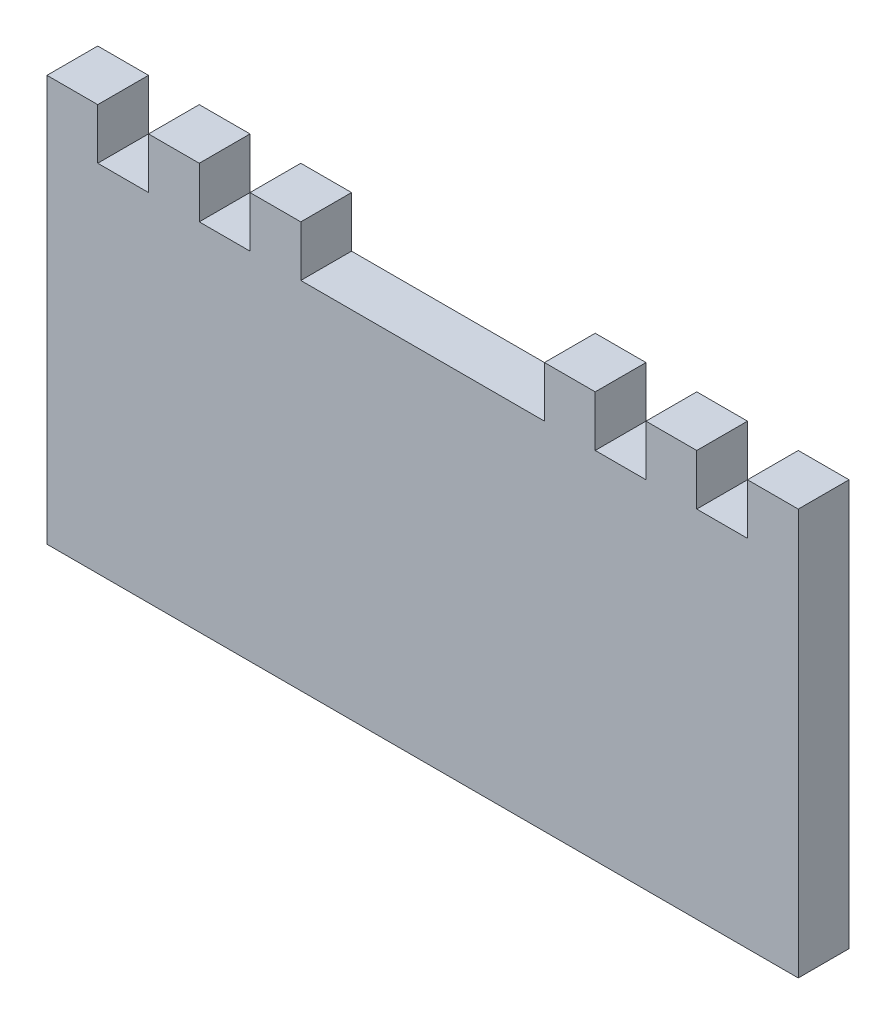
ISO-10303-21;
HEADER;
FILE_DESCRIPTION(('STEP AP214'),'2;1');
FILE_NAME('part.step','',(''),(''),'','','');
FILE_SCHEMA(('AUTOMOTIVE_DESIGN { 1 0 10303 214 1 1 1 1 }'));
ENDSEC;
DATA;
#1=APPLICATION_CONTEXT('core data for automotive mechanical design processes');
#2=APPLICATION_PROTOCOL_DEFINITION('international standard','automotive_design',2000,#1);
#3=PRODUCT_CONTEXT('',#1,'mechanical');
#4=PRODUCT('Part','Part','',(#3));
#5=PRODUCT_RELATED_PRODUCT_CATEGORY('part','',(#4));
#6=PRODUCT_DEFINITION_FORMATION('','',#4);
#7=PRODUCT_DEFINITION_CONTEXT('part definition',#1,'design');
#8=PRODUCT_DEFINITION('design','',#6,#7);
#9=PRODUCT_DEFINITION_SHAPE('','',#8);
#10=(LENGTH_UNIT() NAMED_UNIT(*) SI_UNIT(.MILLI.,.METRE.));
#11=(NAMED_UNIT(*) PLANE_ANGLE_UNIT() SI_UNIT($,.RADIAN.));
#12=(NAMED_UNIT(*) SI_UNIT($,.STERADIAN.) SOLID_ANGLE_UNIT());
#13=UNCERTAINTY_MEASURE_WITH_UNIT(LENGTH_MEASURE(1.E-05),#10,'distance_accuracy_value','');
#14=(GEOMETRIC_REPRESENTATION_CONTEXT(3) GLOBAL_UNCERTAINTY_ASSIGNED_CONTEXT((#13)) GLOBAL_UNIT_ASSIGNED_CONTEXT((#10,
#11,#12)) REPRESENTATION_CONTEXT('',''));
#15=CARTESIAN_POINT('',(0.,0.,0.));
#16=DIRECTION('',(0.,0.,1.));
#17=DIRECTION('',(1.,0.,0.));
#18=AXIS2_PLACEMENT_3D('',#15,#16,#17);
#19=CARTESIAN_POINT('',(-67.192826576935,-4.58125751271907,5.));
#20=DIRECTION('',(-1.,0.,0.));
#21=DIRECTION('',(0.,0.,1.));
#22=AXIS2_PLACEMENT_3D('',#19,#20,#21);
#23=PLANE('',#22);
#24=DIRECTION('',(0.,1.,0.));
#25=VECTOR('',#24,1.);
#26=CARTESIAN_POINT('',(-67.192826576935,-4.58125751271907,0.));
#27=LINE('',#26,#25);
#28=CARTESIAN_POINT('',(-67.192826576935,-9.58125751271907,0.));
#29=VERTEX_POINT('',#28);
#30=CARTESIAN_POINT('',(-67.192826576935,-4.58125751271907,0.));
#31=VERTEX_POINT('',#30);
#32=EDGE_CURVE('E225',#29,#31,#27,.T.);
#33=ORIENTED_EDGE('',*,*,#32,.T.);
#34=DIRECTION('',(0.,0.,-1.));
#35=VECTOR('',#34,1.);
#36=CARTESIAN_POINT('',(-67.192826576935,-4.58125751271907,5.));
#37=LINE('',#36,#35);
#38=CARTESIAN_POINT('',(-67.192826576935,-4.58125751271907,5.));
#39=VERTEX_POINT('',#38);
#40=EDGE_CURVE('E11',#39,#31,#37,.T.);
#41=ORIENTED_EDGE('',*,*,#40,.F.);
#42=DIRECTION('',(0.,1.,0.));
#43=VECTOR('',#42,1.);
#44=CARTESIAN_POINT('',(-67.192826576935,-4.58125751271907,5.));
#45=LINE('',#44,#43);
#46=CARTESIAN_POINT('',(-67.192826576935,-9.58125751271907,5.));
#47=VERTEX_POINT('',#46);
#48=EDGE_CURVE('E271',#47,#39,#45,.T.);
#49=ORIENTED_EDGE('',*,*,#48,.F.);
#50=DIRECTION('',(0.,0.,-1.));
#51=VECTOR('',#50,1.);
#52=CARTESIAN_POINT('',(-67.192826576935,-9.58125751271907,5.));
#53=LINE('',#52,#51);
#54=EDGE_CURVE('E221',#47,#29,#53,.T.);
#55=ORIENTED_EDGE('',*,*,#54,.T.);
#56=EDGE_LOOP('',(#33,#41,#49,#55));
#57=FACE_BOUND('',#56,.T.);
#58=ADVANCED_FACE('F33',(#57),#23,.F.);
#59=CARTESIAN_POINT('',(-67.192826576935,-4.58125751271907,5.));
#60=DIRECTION('',(0.,-1.,0.));
#61=DIRECTION('',(0.,0.,-1.));
#62=AXIS2_PLACEMENT_3D('',#59,#60,#61);
#63=PLANE('',#62);
#64=DIRECTION('',(-1.,0.,0.));
#65=VECTOR('',#64,1.);
#66=CARTESIAN_POINT('',(-67.192826576935,-4.58125751271907,0.));
#67=LINE('',#66,#65);
#68=CARTESIAN_POINT('',(-72.192826576935,-4.58125751271907,0.));
#69=VERTEX_POINT('',#68);
#70=EDGE_CURVE('E228',#31,#69,#67,.T.);
#71=ORIENTED_EDGE('',*,*,#70,.T.);
#72=DIRECTION('',(0.,0.,-1.));
#73=VECTOR('',#72,1.);
#74=CARTESIAN_POINT('',(-72.192826576935,-4.58125751271907,5.));
#75=LINE('',#74,#73);
#76=CARTESIAN_POINT('',(-72.192826576935,-4.58125751271907,5.));
#77=VERTEX_POINT('',#76);
#78=EDGE_CURVE('E41',#77,#69,#75,.T.);
#79=ORIENTED_EDGE('',*,*,#78,.F.);
#80=DIRECTION('',(-1.,0.,0.));
#81=VECTOR('',#80,1.);
#82=CARTESIAN_POINT('',(-67.192826576935,-4.58125751271907,5.));
#83=LINE('',#82,#81);
#84=EDGE_CURVE('E140',#39,#77,#83,.T.);
#85=ORIENTED_EDGE('',*,*,#84,.F.);
#86=ORIENTED_EDGE('',*,*,#40,.T.);
#87=EDGE_LOOP('',(#71,#79,#85,#86));
#88=FACE_BOUND('',#87,.T.);
#89=ADVANCED_FACE('F409',(#88),#63,.F.);
#90=CARTESIAN_POINT('',(-72.192826576935,-4.58125751271907,5.));
#91=DIRECTION('',(1.,0.,0.));
#92=DIRECTION('',(0.,0.,-1.));
#93=AXIS2_PLACEMENT_3D('',#90,#91,#92);
#94=PLANE('',#93);
#95=DIRECTION('',(0.,-1.,0.));
#96=VECTOR('',#95,1.);
#97=CARTESIAN_POINT('',(-72.192826576935,-4.58125751271907,0.));
#98=LINE('',#97,#96);
#99=CARTESIAN_POINT('',(-72.192826576935,-9.58125751271907,0.));
#100=VERTEX_POINT('',#99);
#101=EDGE_CURVE('E230',#69,#100,#98,.T.);
#102=ORIENTED_EDGE('',*,*,#101,.T.);
#103=DIRECTION('',(0.,0.,-1.));
#104=VECTOR('',#103,1.);
#105=CARTESIAN_POINT('',(-72.192826576935,-9.58125751271907,5.));
#106=LINE('',#105,#104);
#107=CARTESIAN_POINT('',(-72.192826576935,-9.58125751271907,5.));
#108=VERTEX_POINT('',#107);
#109=EDGE_CURVE('E326',#108,#100,#106,.T.);
#110=ORIENTED_EDGE('',*,*,#109,.F.);
#111=DIRECTION('',(0.,-1.,0.));
#112=VECTOR('',#111,1.);
#113=CARTESIAN_POINT('',(-72.192826576935,-4.58125751271907,5.));
#114=LINE('',#113,#112);
#115=EDGE_CURVE('E334',#77,#108,#114,.T.);
#116=ORIENTED_EDGE('',*,*,#115,.F.);
#117=ORIENTED_EDGE('',*,*,#78,.T.);
#118=EDGE_LOOP('',(#102,#110,#116,#117));
#119=FACE_BOUND('',#118,.T.);
#120=ADVANCED_FACE('F332',(#119),#94,.F.);
#121=CARTESIAN_POINT('',(-72.192826576935,-9.58125751271907,5.));
#122=DIRECTION('',(0.,-1.,0.));
#123=DIRECTION('',(1.,0.,0.));
#124=AXIS2_PLACEMENT_3D('',#121,#122,#123);
#125=PLANE('',#124);
#126=DIRECTION('',(-1.,0.,0.));
#127=VECTOR('',#126,1.);
#128=CARTESIAN_POINT('',(-72.192826576935,-9.58125751271907,0.));
#129=LINE('',#128,#127);
#130=CARTESIAN_POINT('',(-77.192826576935,-9.58125751271908,0.));
#131=VERTEX_POINT('',#130);
#132=EDGE_CURVE('E232',#100,#131,#129,.T.);
#133=ORIENTED_EDGE('',*,*,#132,.T.);
#134=DIRECTION('',(0.,0.,-1.));
#135=VECTOR('',#134,1.);
#136=CARTESIAN_POINT('',(-77.192826576935,-9.58125751271908,5.));
#137=LINE('',#136,#135);
#138=CARTESIAN_POINT('',(-77.192826576935,-9.58125751271908,5.));
#139=VERTEX_POINT('',#138);
#140=EDGE_CURVE('E323',#139,#131,#137,.T.);
#141=ORIENTED_EDGE('',*,*,#140,.F.);
#142=DIRECTION('',(-1.,0.,0.));
#143=VECTOR('',#142,1.);
#144=CARTESIAN_POINT('',(-72.192826576935,-9.58125751271907,5.));
#145=LINE('',#144,#143);
#146=EDGE_CURVE('E352',#108,#139,#145,.T.);
#147=ORIENTED_EDGE('',*,*,#146,.F.);
#148=ORIENTED_EDGE('',*,*,#109,.T.);
#149=EDGE_LOOP('',(#133,#141,#147,#148));
#150=FACE_BOUND('',#149,.T.);
#151=ADVANCED_FACE('F343',(#150),#125,.F.);
#152=CARTESIAN_POINT('',(-77.192826576935,-4.58125751271907,5.));
#153=DIRECTION('',(-1.,0.,0.));
#154=DIRECTION('',(0.,0.,1.));
#155=AXIS2_PLACEMENT_3D('',#152,#153,#154);
#156=PLANE('',#155);
#157=DIRECTION('',(0.,1.,0.));
#158=VECTOR('',#157,1.);
#159=CARTESIAN_POINT('',(-77.192826576935,-4.58125751271907,0.));
#160=LINE('',#159,#158);
#161=CARTESIAN_POINT('',(-77.192826576935,-4.58125751271907,0.));
#162=VERTEX_POINT('',#161);
#163=EDGE_CURVE('E234',#131,#162,#160,.T.);
#164=ORIENTED_EDGE('',*,*,#163,.T.);
#165=DIRECTION('',(0.,0.,-1.));
#166=VECTOR('',#165,1.);
#167=CARTESIAN_POINT('',(-77.192826576935,-4.58125751271907,5.));
#168=LINE('',#167,#166);
#169=CARTESIAN_POINT('',(-77.192826576935,-4.58125751271907,5.));
#170=VERTEX_POINT('',#169);
#171=EDGE_CURVE('E320',#170,#162,#168,.T.);
#172=ORIENTED_EDGE('',*,*,#171,.F.);
#173=DIRECTION('',(0.,1.,0.));
#174=VECTOR('',#173,1.);
#175=CARTESIAN_POINT('',(-77.192826576935,-4.58125751271907,5.));
#176=LINE('',#175,#174);
#177=EDGE_CURVE('E349',#139,#170,#176,.T.);
#178=ORIENTED_EDGE('',*,*,#177,.F.);
#179=ORIENTED_EDGE('',*,*,#140,.T.);
#180=EDGE_LOOP('',(#164,#172,#178,#179));
#181=FACE_BOUND('',#180,.T.);
#182=ADVANCED_FACE('F347',(#181),#156,.F.);
#183=CARTESIAN_POINT('',(-82.192826576935,-4.58125751271907,5.));
#184=DIRECTION('',(0.,-1.,0.));
#185=DIRECTION('',(0.,0.,-1.));
#186=AXIS2_PLACEMENT_3D('',#183,#184,#185);
#187=PLANE('',#186);
#188=DIRECTION('',(-1.,0.,0.));
#189=VECTOR('',#188,1.);
#190=CARTESIAN_POINT('',(-82.192826576935,-4.58125751271907,0.));
#191=LINE('',#190,#189);
#192=CARTESIAN_POINT('',(-82.192826576935,-4.58125751271907,0.));
#193=VERTEX_POINT('',#192);
#194=EDGE_CURVE('E236',#162,#193,#191,.T.);
#195=ORIENTED_EDGE('',*,*,#194,.T.);
#196=DIRECTION('',(0.,0.,-1.));
#197=VECTOR('',#196,1.);
#198=CARTESIAN_POINT('',(-82.192826576935,-4.58125751271907,5.));
#199=LINE('',#198,#197);
#200=CARTESIAN_POINT('',(-82.192826576935,-4.58125751271907,5.));
#201=VERTEX_POINT('',#200);
#202=EDGE_CURVE('E317',#201,#193,#199,.T.);
#203=ORIENTED_EDGE('',*,*,#202,.F.);
#204=DIRECTION('',(-1.,0.,0.));
#205=VECTOR('',#204,1.);
#206=CARTESIAN_POINT('',(-82.192826576935,-4.58125751271907,5.));
#207=LINE('',#206,#205);
#208=EDGE_CURVE('E351',#170,#201,#207,.T.);
#209=ORIENTED_EDGE('',*,*,#208,.F.);
#210=ORIENTED_EDGE('',*,*,#171,.T.);
#211=EDGE_LOOP('',(#195,#203,#209,#210));
#212=FACE_BOUND('',#211,.T.);
#213=ADVANCED_FACE('F422',(#212),#187,.F.);
#214=CARTESIAN_POINT('',(-82.192826576935,-4.58125751271907,5.));
#215=DIRECTION('',(1.,0.,0.));
#216=DIRECTION('',(0.,0.,-1.));
#217=AXIS2_PLACEMENT_3D('',#214,#215,#216);
#218=PLANE('',#217);
#219=DIRECTION('',(0.,-1.,0.));
#220=VECTOR('',#219,1.);
#221=CARTESIAN_POINT('',(-82.192826576935,-4.58125751271907,0.));
#222=LINE('',#221,#220);
#223=CARTESIAN_POINT('',(-82.192826576935,-9.58125751271907,0.));
#224=VERTEX_POINT('',#223);
#225=EDGE_CURVE('E238',#193,#224,#222,.T.);
#226=ORIENTED_EDGE('',*,*,#225,.T.);
#227=DIRECTION('',(0.,0.,-1.));
#228=VECTOR('',#227,1.);
#229=CARTESIAN_POINT('',(-82.192826576935,-9.58125751271907,5.));
#230=LINE('',#229,#228);
#231=CARTESIAN_POINT('',(-82.192826576935,-9.58125751271907,5.));
#232=VERTEX_POINT('',#231);
#233=EDGE_CURVE('E314',#232,#224,#230,.T.);
#234=ORIENTED_EDGE('',*,*,#233,.F.);
#235=DIRECTION('',(0.,-1.,0.));
#236=VECTOR('',#235,1.);
#237=CARTESIAN_POINT('',(-82.192826576935,-4.58125751271907,5.));
#238=LINE('',#237,#236);
#239=EDGE_CURVE('E354',#201,#232,#238,.T.);
#240=ORIENTED_EDGE('',*,*,#239,.F.);
#241=ORIENTED_EDGE('',*,*,#202,.T.);
#242=EDGE_LOOP('',(#226,#234,#240,#241));
#243=FACE_BOUND('',#242,.T.);
#244=ADVANCED_FACE('F425',(#243),#218,.F.);
#245=CARTESIAN_POINT('',(-82.192826576935,-9.58125751271907,5.));
#246=DIRECTION('',(0.,-1.,0.));
#247=DIRECTION('',(0.,0.,-1.));
#248=AXIS2_PLACEMENT_3D('',#245,#246,#247);
#249=PLANE('',#248);
#250=DIRECTION('',(-1.,0.,0.));
#251=VECTOR('',#250,1.);
#252=CARTESIAN_POINT('',(-82.192826576935,-9.58125751271907,0.));
#253=LINE('',#252,#251);
#254=CARTESIAN_POINT('',(-87.192826576935,-9.58125751271907,0.));
#255=VERTEX_POINT('',#254);
#256=EDGE_CURVE('E240',#224,#255,#253,.T.);
#257=ORIENTED_EDGE('',*,*,#256,.T.);
#258=DIRECTION('',(0.,0.,-1.));
#259=VECTOR('',#258,1.);
#260=CARTESIAN_POINT('',(-87.192826576935,-9.58125751271907,5.));
#261=LINE('',#260,#259);
#262=CARTESIAN_POINT('',(-87.192826576935,-9.58125751271907,5.));
#263=VERTEX_POINT('',#262);
#264=EDGE_CURVE('E311',#263,#255,#261,.T.);
#265=ORIENTED_EDGE('',*,*,#264,.F.);
#266=DIRECTION('',(-1.,0.,0.));
#267=VECTOR('',#266,1.);
#268=CARTESIAN_POINT('',(-82.192826576935,-9.58125751271907,5.));
#269=LINE('',#268,#267);
#270=EDGE_CURVE('E360',#232,#263,#269,.T.);
#271=ORIENTED_EDGE('',*,*,#270,.F.);
#272=ORIENTED_EDGE('',*,*,#233,.T.);
#273=EDGE_LOOP('',(#257,#265,#271,#272));
#274=FACE_BOUND('',#273,.T.);
#275=ADVANCED_FACE('F429',(#274),#249,.F.);
#276=CARTESIAN_POINT('',(-87.192826576935,-4.58125751271907,5.));
#277=DIRECTION('',(-1.,0.,0.));
#278=DIRECTION('',(0.,0.,1.));
#279=AXIS2_PLACEMENT_3D('',#276,#277,#278);
#280=PLANE('',#279);
#281=DIRECTION('',(0.,1.,0.));
#282=VECTOR('',#281,1.);
#283=CARTESIAN_POINT('',(-87.192826576935,-4.58125751271907,0.));
#284=LINE('',#283,#282);
#285=CARTESIAN_POINT('',(-87.192826576935,-4.58125751271907,0.));
#286=VERTEX_POINT('',#285);
#287=EDGE_CURVE('E242',#255,#286,#284,.T.);
#288=ORIENTED_EDGE('',*,*,#287,.T.);
#289=DIRECTION('',(0.,0.,-1.));
#290=VECTOR('',#289,1.);
#291=CARTESIAN_POINT('',(-87.192826576935,-4.58125751271907,5.));
#292=LINE('',#291,#290);
#293=CARTESIAN_POINT('',(-87.192826576935,-4.58125751271907,5.));
#294=VERTEX_POINT('',#293);
#295=EDGE_CURVE('E308',#294,#286,#292,.T.);
#296=ORIENTED_EDGE('',*,*,#295,.F.);
#297=DIRECTION('',(0.,1.,0.));
#298=VECTOR('',#297,1.);
#299=CARTESIAN_POINT('',(-87.192826576935,-4.58125751271907,5.));
#300=LINE('',#299,#298);
#301=EDGE_CURVE('E362',#263,#294,#300,.T.);
#302=ORIENTED_EDGE('',*,*,#301,.F.);
#303=ORIENTED_EDGE('',*,*,#264,.T.);
#304=EDGE_LOOP('',(#288,#296,#302,#303));
#305=FACE_BOUND('',#304,.T.);
#306=ADVANCED_FACE('F433',(#305),#280,.F.);
#307=CARTESIAN_POINT('',(-92.192826576935,-4.58125751271907,5.));
#308=DIRECTION('',(0.,-1.,0.));
#309=DIRECTION('',(0.,0.,-1.));
#310=AXIS2_PLACEMENT_3D('',#307,#308,#309);
#311=PLANE('',#310);
#312=DIRECTION('',(-1.,0.,0.));
#313=VECTOR('',#312,1.);
#314=CARTESIAN_POINT('',(-92.192826576935,-4.58125751271907,0.));
#315=LINE('',#314,#313);
#316=CARTESIAN_POINT('',(-92.192826576935,-4.58125751271907,0.));
#317=VERTEX_POINT('',#316);
#318=EDGE_CURVE('E244',#286,#317,#315,.T.);
#319=ORIENTED_EDGE('',*,*,#318,.T.);
#320=DIRECTION('',(0.,0.,-1.));
#321=VECTOR('',#320,1.);
#322=CARTESIAN_POINT('',(-92.192826576935,-4.58125751271907,5.));
#323=LINE('',#322,#321);
#324=CARTESIAN_POINT('',(-92.192826576935,-4.58125751271907,5.));
#325=VERTEX_POINT('',#324);
#326=EDGE_CURVE('E305',#325,#317,#323,.T.);
#327=ORIENTED_EDGE('',*,*,#326,.F.);
#328=DIRECTION('',(-1.,0.,0.));
#329=VECTOR('',#328,1.);
#330=CARTESIAN_POINT('',(-92.192826576935,-4.58125751271907,5.));
#331=LINE('',#330,#329);
#332=EDGE_CURVE('E364',#294,#325,#331,.T.);
#333=ORIENTED_EDGE('',*,*,#332,.F.);
#334=ORIENTED_EDGE('',*,*,#295,.T.);
#335=EDGE_LOOP('',(#319,#327,#333,#334));
#336=FACE_BOUND('',#335,.T.);
#337=ADVANCED_FACE('F437',(#336),#311,.F.);
#338=CARTESIAN_POINT('',(-92.192826576935,-44.5812575127191,5.));
#339=DIRECTION('',(1.,0.,0.));
#340=DIRECTION('',(0.,0.,-1.));
#341=AXIS2_PLACEMENT_3D('',#338,#339,#340);
#342=PLANE('',#341);
#343=DIRECTION('',(0.,-1.,0.));
#344=VECTOR('',#343,1.);
#345=CARTESIAN_POINT('',(-92.192826576935,-44.5812575127191,0.));
#346=LINE('',#345,#344);
#347=CARTESIAN_POINT('',(-92.192826576935,-44.5812575127191,0.));
#348=VERTEX_POINT('',#347);
#349=EDGE_CURVE('E246',#317,#348,#346,.T.);
#350=ORIENTED_EDGE('',*,*,#349,.T.);
#351=DIRECTION('',(0.,0.,-1.));
#352=VECTOR('',#351,1.);
#353=CARTESIAN_POINT('',(-92.192826576935,-44.5812575127191,5.));
#354=LINE('',#353,#352);
#355=CARTESIAN_POINT('',(-92.192826576935,-44.5812575127191,5.));
#356=VERTEX_POINT('',#355);
#357=EDGE_CURVE('E302',#356,#348,#354,.T.);
#358=ORIENTED_EDGE('',*,*,#357,.F.);
#359=DIRECTION('',(0.,-1.,0.));
#360=VECTOR('',#359,1.);
#361=CARTESIAN_POINT('',(-92.192826576935,-44.5812575127191,5.));
#362=LINE('',#361,#360);
#363=EDGE_CURVE('E366',#325,#356,#362,.T.);
#364=ORIENTED_EDGE('',*,*,#363,.F.);
#365=ORIENTED_EDGE('',*,*,#326,.T.);
#366=EDGE_LOOP('',(#350,#358,#364,#365));
#367=FACE_BOUND('',#366,.T.);
#368=ADVANCED_FACE('F441',(#367),#342,.F.);
#369=CARTESIAN_POINT('',(-18.192826576935,-44.5812575127191,5.));
#370=DIRECTION('',(0.,1.,0.));
#371=DIRECTION('',(0.,0.,1.));
#372=AXIS2_PLACEMENT_3D('',#369,#370,#371);
#373=PLANE('',#372);
#374=DIRECTION('',(1.,0.,0.));
#375=VECTOR('',#374,1.);
#376=CARTESIAN_POINT('',(-18.192826576935,-44.5812575127191,0.));
#377=LINE('',#376,#375);
#378=CARTESIAN_POINT('',(-18.192826576935,-44.5812575127191,0.));
#379=VERTEX_POINT('',#378);
#380=EDGE_CURVE('E248',#348,#379,#377,.T.);
#381=ORIENTED_EDGE('',*,*,#380,.T.);
#382=DIRECTION('',(0.,0.,-1.));
#383=VECTOR('',#382,1.);
#384=CARTESIAN_POINT('',(-18.192826576935,-44.5812575127191,5.));
#385=LINE('',#384,#383);
#386=CARTESIAN_POINT('',(-18.192826576935,-44.5812575127191,5.));
#387=VERTEX_POINT('',#386);
#388=EDGE_CURVE('E299',#387,#379,#385,.T.);
#389=ORIENTED_EDGE('',*,*,#388,.F.);
#390=DIRECTION('',(1.,0.,0.));
#391=VECTOR('',#390,1.);
#392=CARTESIAN_POINT('',(-18.192826576935,-44.5812575127191,5.));
#393=LINE('',#392,#391);
#394=EDGE_CURVE('E368',#356,#387,#393,.T.);
#395=ORIENTED_EDGE('',*,*,#394,.F.);
#396=ORIENTED_EDGE('',*,*,#357,.T.);
#397=EDGE_LOOP('',(#381,#389,#395,#396));
#398=FACE_BOUND('',#397,.T.);
#399=ADVANCED_FACE('F445',(#398),#373,.F.);
#400=CARTESIAN_POINT('',(-18.192826576935,-44.5812575127191,5.));
#401=DIRECTION('',(-1.,0.,0.));
#402=DIRECTION('',(0.,-1.,0.));
#403=AXIS2_PLACEMENT_3D('',#400,#401,#402);
#404=PLANE('',#403);
#405=DIRECTION('',(0.,1.,0.));
#406=VECTOR('',#405,1.);
#407=CARTESIAN_POINT('',(-18.192826576935,-44.5812575127191,0.));
#408=LINE('',#407,#406);
#409=CARTESIAN_POINT('',(-18.192826576935,-4.58125751271907,0.));
#410=VERTEX_POINT('',#409);
#411=EDGE_CURVE('E250',#379,#410,#408,.T.);
#412=ORIENTED_EDGE('',*,*,#411,.T.);
#413=DIRECTION('',(0.,0.,-1.));
#414=VECTOR('',#413,1.);
#415=CARTESIAN_POINT('',(-18.192826576935,-4.58125751271907,5.));
#416=LINE('',#415,#414);
#417=CARTESIAN_POINT('',(-18.192826576935,-4.58125751271907,5.));
#418=VERTEX_POINT('',#417);
#419=EDGE_CURVE('E296',#418,#410,#416,.T.);
#420=ORIENTED_EDGE('',*,*,#419,.F.);
#421=DIRECTION('',(0.,1.,0.));
#422=VECTOR('',#421,1.);
#423=CARTESIAN_POINT('',(-18.192826576935,-44.5812575127191,5.));
#424=LINE('',#423,#422);
#425=EDGE_CURVE('E370',#387,#418,#424,.T.);
#426=ORIENTED_EDGE('',*,*,#425,.F.);
#427=ORIENTED_EDGE('',*,*,#388,.T.);
#428=EDGE_LOOP('',(#412,#420,#426,#427));
#429=FACE_BOUND('',#428,.T.);
#430=ADVANCED_FACE('F449',(#429),#404,.F.);
#431=CARTESIAN_POINT('',(-18.192826576935,-4.58125751271907,5.));
#432=DIRECTION('',(0.,-1.,0.));
#433=DIRECTION('',(0.,0.,-1.));
#434=AXIS2_PLACEMENT_3D('',#431,#432,#433);
#435=PLANE('',#434);
#436=DIRECTION('',(-1.,0.,0.));
#437=VECTOR('',#436,1.);
#438=CARTESIAN_POINT('',(-18.192826576935,-4.58125751271907,0.));
#439=LINE('',#438,#437);
#440=CARTESIAN_POINT('',(-23.192826576935,-4.58125751271907,0.));
#441=VERTEX_POINT('',#440);
#442=EDGE_CURVE('E252',#410,#441,#439,.T.);
#443=ORIENTED_EDGE('',*,*,#442,.T.);
#444=DIRECTION('',(0.,0.,-1.));
#445=VECTOR('',#444,1.);
#446=CARTESIAN_POINT('',(-23.192826576935,-4.58125751271907,5.));
#447=LINE('',#446,#445);
#448=CARTESIAN_POINT('',(-23.192826576935,-4.58125751271907,5.));
#449=VERTEX_POINT('',#448);
#450=EDGE_CURVE('E293',#449,#441,#447,.T.);
#451=ORIENTED_EDGE('',*,*,#450,.F.);
#452=DIRECTION('',(-1.,0.,0.));
#453=VECTOR('',#452,1.);
#454=CARTESIAN_POINT('',(-18.192826576935,-4.58125751271907,5.));
#455=LINE('',#454,#453);
#456=EDGE_CURVE('E372',#418,#449,#455,.T.);
#457=ORIENTED_EDGE('',*,*,#456,.F.);
#458=ORIENTED_EDGE('',*,*,#419,.T.);
#459=EDGE_LOOP('',(#443,#451,#457,#458));
#460=FACE_BOUND('',#459,.T.);
#461=ADVANCED_FACE('F453',(#460),#435,.F.);
#462=CARTESIAN_POINT('',(-23.192826576935,-4.58125751271907,5.));
#463=DIRECTION('',(1.,0.,0.));
#464=DIRECTION('',(0.,0.,-1.));
#465=AXIS2_PLACEMENT_3D('',#462,#463,#464);
#466=PLANE('',#465);
#467=DIRECTION('',(0.,-1.,0.));
#468=VECTOR('',#467,1.);
#469=CARTESIAN_POINT('',(-23.192826576935,-4.58125751271907,0.));
#470=LINE('',#469,#468);
#471=CARTESIAN_POINT('',(-23.192826576935,-9.58125751271907,0.));
#472=VERTEX_POINT('',#471);
#473=EDGE_CURVE('E254',#441,#472,#470,.T.);
#474=ORIENTED_EDGE('',*,*,#473,.T.);
#475=DIRECTION('',(0.,0.,-1.));
#476=VECTOR('',#475,1.);
#477=CARTESIAN_POINT('',(-23.192826576935,-9.58125751271907,5.));
#478=LINE('',#477,#476);
#479=CARTESIAN_POINT('',(-23.192826576935,-9.58125751271907,5.));
#480=VERTEX_POINT('',#479);
#481=EDGE_CURVE('E290',#480,#472,#478,.T.);
#482=ORIENTED_EDGE('',*,*,#481,.F.);
#483=DIRECTION('',(0.,-1.,0.));
#484=VECTOR('',#483,1.);
#485=CARTESIAN_POINT('',(-23.192826576935,-4.58125751271907,5.));
#486=LINE('',#485,#484);
#487=EDGE_CURVE('E374',#449,#480,#486,.T.);
#488=ORIENTED_EDGE('',*,*,#487,.F.);
#489=ORIENTED_EDGE('',*,*,#450,.T.);
#490=EDGE_LOOP('',(#474,#482,#488,#489));
#491=FACE_BOUND('',#490,.T.);
#492=ADVANCED_FACE('F457',(#491),#466,.F.);
#493=CARTESIAN_POINT('',(-28.192826576935,-9.58125751271907,5.));
#494=DIRECTION('',(0.,-1.,0.));
#495=DIRECTION('',(0.,0.,-1.));
#496=AXIS2_PLACEMENT_3D('',#493,#494,#495);
#497=PLANE('',#496);
#498=DIRECTION('',(-1.,0.,0.));
#499=VECTOR('',#498,1.);
#500=CARTESIAN_POINT('',(-28.192826576935,-9.58125751271907,0.));
#501=LINE('',#500,#499);
#502=CARTESIAN_POINT('',(-28.192826576935,-9.58125751271907,0.));
#503=VERTEX_POINT('',#502);
#504=EDGE_CURVE('E256',#472,#503,#501,.T.);
#505=ORIENTED_EDGE('',*,*,#504,.T.);
#506=DIRECTION('',(0.,0.,-1.));
#507=VECTOR('',#506,1.);
#508=CARTESIAN_POINT('',(-28.192826576935,-9.58125751271907,5.));
#509=LINE('',#508,#507);
#510=CARTESIAN_POINT('',(-28.192826576935,-9.58125751271907,5.));
#511=VERTEX_POINT('',#510);
#512=EDGE_CURVE('E287',#511,#503,#509,.T.);
#513=ORIENTED_EDGE('',*,*,#512,.F.);
#514=DIRECTION('',(-1.,0.,0.));
#515=VECTOR('',#514,1.);
#516=CARTESIAN_POINT('',(-28.192826576935,-9.58125751271907,5.));
#517=LINE('',#516,#515);
#518=EDGE_CURVE('E376',#480,#511,#517,.T.);
#519=ORIENTED_EDGE('',*,*,#518,.F.);
#520=ORIENTED_EDGE('',*,*,#481,.T.);
#521=EDGE_LOOP('',(#505,#513,#519,#520));
#522=FACE_BOUND('',#521,.T.);
#523=ADVANCED_FACE('F461',(#522),#497,.F.);
#524=CARTESIAN_POINT('',(-28.192826576935,-4.58125751271907,5.));
#525=DIRECTION('',(-1.,0.,0.));
#526=DIRECTION('',(0.,0.,1.));
#527=AXIS2_PLACEMENT_3D('',#524,#525,#526);
#528=PLANE('',#527);
#529=DIRECTION('',(0.,1.,0.));
#530=VECTOR('',#529,1.);
#531=CARTESIAN_POINT('',(-28.192826576935,-4.58125751271907,0.));
#532=LINE('',#531,#530);
#533=CARTESIAN_POINT('',(-28.192826576935,-4.58125751271907,0.));
#534=VERTEX_POINT('',#533);
#535=EDGE_CURVE('E258',#503,#534,#532,.T.);
#536=ORIENTED_EDGE('',*,*,#535,.T.);
#537=DIRECTION('',(0.,0.,-1.));
#538=VECTOR('',#537,1.);
#539=CARTESIAN_POINT('',(-28.192826576935,-4.58125751271907,5.));
#540=LINE('',#539,#538);
#541=CARTESIAN_POINT('',(-28.192826576935,-4.58125751271907,5.));
#542=VERTEX_POINT('',#541);
#543=EDGE_CURVE('E284',#542,#534,#540,.T.);
#544=ORIENTED_EDGE('',*,*,#543,.F.);
#545=DIRECTION('',(0.,1.,0.));
#546=VECTOR('',#545,1.);
#547=CARTESIAN_POINT('',(-28.192826576935,-4.58125751271907,5.));
#548=LINE('',#547,#546);
#549=EDGE_CURVE('E378',#511,#542,#548,.T.);
#550=ORIENTED_EDGE('',*,*,#549,.F.);
#551=ORIENTED_EDGE('',*,*,#512,.T.);
#552=EDGE_LOOP('',(#536,#544,#550,#551));
#553=FACE_BOUND('',#552,.T.);
#554=ADVANCED_FACE('F465',(#553),#528,.F.);
#555=CARTESIAN_POINT('',(-28.192826576935,-4.58125751271907,5.));
#556=DIRECTION('',(0.,-1.,0.));
#557=DIRECTION('',(0.,0.,-1.));
#558=AXIS2_PLACEMENT_3D('',#555,#556,#557);
#559=PLANE('',#558);
#560=DIRECTION('',(-1.,0.,0.));
#561=VECTOR('',#560,1.);
#562=CARTESIAN_POINT('',(-28.192826576935,-4.58125751271907,0.));
#563=LINE('',#562,#561);
#564=CARTESIAN_POINT('',(-33.192826576935,-4.58125751271907,0.));
#565=VERTEX_POINT('',#564);
#566=EDGE_CURVE('E260',#534,#565,#563,.T.);
#567=ORIENTED_EDGE('',*,*,#566,.T.);
#568=DIRECTION('',(0.,0.,-1.));
#569=VECTOR('',#568,1.);
#570=CARTESIAN_POINT('',(-33.192826576935,-4.58125751271907,5.));
#571=LINE('',#570,#569);
#572=CARTESIAN_POINT('',(-33.192826576935,-4.58125751271907,5.));
#573=VERTEX_POINT('',#572);
#574=EDGE_CURVE('E281',#573,#565,#571,.T.);
#575=ORIENTED_EDGE('',*,*,#574,.F.);
#576=DIRECTION('',(-1.,0.,0.));
#577=VECTOR('',#576,1.);
#578=CARTESIAN_POINT('',(-28.192826576935,-4.58125751271907,5.));
#579=LINE('',#578,#577);
#580=EDGE_CURVE('E380',#542,#573,#579,.T.);
#581=ORIENTED_EDGE('',*,*,#580,.F.);
#582=ORIENTED_EDGE('',*,*,#543,.T.);
#583=EDGE_LOOP('',(#567,#575,#581,#582));
#584=FACE_BOUND('',#583,.T.);
#585=ADVANCED_FACE('F469',(#584),#559,.F.);
#586=CARTESIAN_POINT('',(-33.192826576935,-4.58125751271907,5.));
#587=DIRECTION('',(1.,0.,0.));
#588=DIRECTION('',(0.,0.,-1.));
#589=AXIS2_PLACEMENT_3D('',#586,#587,#588);
#590=PLANE('',#589);
#591=DIRECTION('',(0.,-1.,0.));
#592=VECTOR('',#591,1.);
#593=CARTESIAN_POINT('',(-33.192826576935,-4.58125751271907,0.));
#594=LINE('',#593,#592);
#595=CARTESIAN_POINT('',(-33.192826576935,-9.58125751271908,0.));
#596=VERTEX_POINT('',#595);
#597=EDGE_CURVE('E262',#565,#596,#594,.T.);
#598=ORIENTED_EDGE('',*,*,#597,.T.);
#599=DIRECTION('',(0.,0.,-1.));
#600=VECTOR('',#599,1.);
#601=CARTESIAN_POINT('',(-33.192826576935,-9.58125751271908,5.));
#602=LINE('',#601,#600);
#603=CARTESIAN_POINT('',(-33.192826576935,-9.58125751271908,5.));
#604=VERTEX_POINT('',#603);
#605=EDGE_CURVE('E278',#604,#596,#602,.T.);
#606=ORIENTED_EDGE('',*,*,#605,.F.);
#607=DIRECTION('',(0.,-1.,0.));
#608=VECTOR('',#607,1.);
#609=CARTESIAN_POINT('',(-33.192826576935,-4.58125751271907,5.));
#610=LINE('',#609,#608);
#611=EDGE_CURVE('E382',#573,#604,#610,.T.);
#612=ORIENTED_EDGE('',*,*,#611,.F.);
#613=ORIENTED_EDGE('',*,*,#574,.T.);
#614=EDGE_LOOP('',(#598,#606,#612,#613));
#615=FACE_BOUND('',#614,.T.);
#616=ADVANCED_FACE('F473',(#615),#590,.F.);
#617=CARTESIAN_POINT('',(-38.192826576935,-9.58125751271907,5.));
#618=DIRECTION('',(0.,-1.,0.));
#619=DIRECTION('',(1.,0.,0.));
#620=AXIS2_PLACEMENT_3D('',#617,#618,#619);
#621=PLANE('',#620);
#622=DIRECTION('',(-1.,0.,0.));
#623=VECTOR('',#622,1.);
#624=CARTESIAN_POINT('',(-38.192826576935,-9.58125751271907,0.));
#625=LINE('',#624,#623);
#626=CARTESIAN_POINT('',(-38.192826576935,-9.58125751271907,0.));
#627=VERTEX_POINT('',#626);
#628=EDGE_CURVE('E264',#596,#627,#625,.T.);
#629=ORIENTED_EDGE('',*,*,#628,.T.);
#630=DIRECTION('',(0.,0.,-1.));
#631=VECTOR('',#630,1.);
#632=CARTESIAN_POINT('',(-38.192826576935,-9.58125751271907,5.));
#633=LINE('',#632,#631);
#634=CARTESIAN_POINT('',(-38.192826576935,-9.58125751271907,5.));
#635=VERTEX_POINT('',#634);
#636=EDGE_CURVE('E275',#635,#627,#633,.T.);
#637=ORIENTED_EDGE('',*,*,#636,.F.);
#638=DIRECTION('',(-1.,0.,0.));
#639=VECTOR('',#638,1.);
#640=CARTESIAN_POINT('',(-38.192826576935,-9.58125751271907,5.));
#641=LINE('',#640,#639);
#642=EDGE_CURVE('E384',#604,#635,#641,.T.);
#643=ORIENTED_EDGE('',*,*,#642,.F.);
#644=ORIENTED_EDGE('',*,*,#605,.T.);
#645=EDGE_LOOP('',(#629,#637,#643,#644));
#646=FACE_BOUND('',#645,.T.);
#647=ADVANCED_FACE('F390',(#646),#621,.F.);
#648=CARTESIAN_POINT('',(-38.192826576935,-4.58125751271907,5.));
#649=DIRECTION('',(-1.,0.,0.));
#650=DIRECTION('',(0.,0.,1.));
#651=AXIS2_PLACEMENT_3D('',#648,#649,#650);
#652=PLANE('',#651);
#653=DIRECTION('',(0.,1.,0.));
#654=VECTOR('',#653,1.);
#655=CARTESIAN_POINT('',(-38.192826576935,-4.58125751271907,0.));
#656=LINE('',#655,#654);
#657=CARTESIAN_POINT('',(-38.192826576935,-4.58125751271907,0.));
#658=VERTEX_POINT('',#657);
#659=EDGE_CURVE('E266',#627,#658,#656,.T.);
#660=ORIENTED_EDGE('',*,*,#659,.T.);
#661=DIRECTION('',(0.,0.,-1.));
#662=VECTOR('',#661,1.);
#663=CARTESIAN_POINT('',(-38.192826576935,-4.58125751271907,5.));
#664=LINE('',#663,#662);
#665=CARTESIAN_POINT('',(-38.192826576935,-4.58125751271907,5.));
#666=VERTEX_POINT('',#665);
#667=EDGE_CURVE('E216',#666,#658,#664,.T.);
#668=ORIENTED_EDGE('',*,*,#667,.F.);
#669=DIRECTION('',(0.,1.,0.));
#670=VECTOR('',#669,1.);
#671=CARTESIAN_POINT('',(-38.192826576935,-4.58125751271907,5.));
#672=LINE('',#671,#670);
#673=EDGE_CURVE('E207',#635,#666,#672,.T.);
#674=ORIENTED_EDGE('',*,*,#673,.F.);
#675=ORIENTED_EDGE('',*,*,#636,.T.);
#676=EDGE_LOOP('',(#660,#668,#674,#675));
#677=FACE_BOUND('',#676,.T.);
#678=ADVANCED_FACE('F394',(#677),#652,.F.);
#679=CARTESIAN_POINT('',(-43.192826576935,-4.58125751271907,5.));
#680=DIRECTION('',(0.,-1.,0.));
#681=DIRECTION('',(0.,0.,-1.));
#682=AXIS2_PLACEMENT_3D('',#679,#680,#681);
#683=PLANE('',#682);
#684=DIRECTION('',(-1.,0.,0.));
#685=VECTOR('',#684,1.);
#686=CARTESIAN_POINT('',(-43.192826576935,-4.58125751271907,0.));
#687=LINE('',#686,#685);
#688=CARTESIAN_POINT('',(-43.192826576935,-4.58125751271907,0.));
#689=VERTEX_POINT('',#688);
#690=EDGE_CURVE('E215',#658,#689,#687,.T.);
#691=ORIENTED_EDGE('',*,*,#690,.T.);
#692=DIRECTION('',(0.,0.,-1.));
#693=VECTOR('',#692,1.);
#694=CARTESIAN_POINT('',(-43.192826576935,-4.58125751271907,5.));
#695=LINE('',#694,#693);
#696=CARTESIAN_POINT('',(-43.192826576935,-4.58125751271907,5.));
#697=VERTEX_POINT('',#696);
#698=EDGE_CURVE('E212',#697,#689,#695,.T.);
#699=ORIENTED_EDGE('',*,*,#698,.F.);
#700=DIRECTION('',(-1.,0.,0.));
#701=VECTOR('',#700,1.);
#702=CARTESIAN_POINT('',(-43.192826576935,-4.58125751271907,5.));
#703=LINE('',#702,#701);
#704=EDGE_CURVE('E201',#666,#697,#703,.T.);
#705=ORIENTED_EDGE('',*,*,#704,.F.);
#706=ORIENTED_EDGE('',*,*,#667,.T.);
#707=EDGE_LOOP('',(#691,#699,#705,#706));
#708=FACE_BOUND('',#707,.T.);
#709=ADVANCED_FACE('F213',(#708),#683,.F.);
#710=CARTESIAN_POINT('',(-43.192826576935,-4.58125751271907,5.));
#711=DIRECTION('',(1.,0.,0.));
#712=DIRECTION('',(0.,0.,-1.));
#713=AXIS2_PLACEMENT_3D('',#710,#711,#712);
#714=PLANE('',#713);
#715=DIRECTION('',(0.,-1.,0.));
#716=VECTOR('',#715,1.);
#717=CARTESIAN_POINT('',(-43.192826576935,-4.58125751271907,0.));
#718=LINE('',#717,#716);
#719=CARTESIAN_POINT('',(-43.192826576935,-9.58125751271907,0.));
#720=VERTEX_POINT('',#719);
#721=EDGE_CURVE('E126',#689,#720,#718,.T.);
#722=ORIENTED_EDGE('',*,*,#721,.T.);
#723=DIRECTION('',(0.,0.,-1.));
#724=VECTOR('',#723,1.);
#725=CARTESIAN_POINT('',(-43.192826576935,-9.58125751271907,5.));
#726=LINE('',#725,#724);
#727=CARTESIAN_POINT('',(-43.192826576935,-9.58125751271907,5.));
#728=VERTEX_POINT('',#727);
#729=EDGE_CURVE('E217',#728,#720,#726,.T.);
#730=ORIENTED_EDGE('',*,*,#729,.F.);
#731=DIRECTION('',(0.,-1.,0.));
#732=VECTOR('',#731,1.);
#733=CARTESIAN_POINT('',(-43.192826576935,-4.58125751271907,5.));
#734=LINE('',#733,#732);
#735=EDGE_CURVE('E205',#697,#728,#734,.T.);
#736=ORIENTED_EDGE('',*,*,#735,.F.);
#737=ORIENTED_EDGE('',*,*,#698,.T.);
#738=EDGE_LOOP('',(#722,#730,#736,#737));
#739=FACE_BOUND('',#738,.T.);
#740=ADVANCED_FACE('F219',(#739),#714,.F.);
#741=CARTESIAN_POINT('',(-43.192826576935,-9.58125751271907,5.));
#742=DIRECTION('',(0.,-1.,0.));
#743=DIRECTION('',(0.,0.,-1.));
#744=AXIS2_PLACEMENT_3D('',#741,#742,#743);
#745=PLANE('',#744);
#746=DIRECTION('',(-1.,0.,0.));
#747=VECTOR('',#746,1.);
#748=CARTESIAN_POINT('',(-43.192826576935,-9.58125751271907,0.));
#749=LINE('',#748,#747);
#750=EDGE_CURVE('E132',#720,#29,#749,.T.);
#751=ORIENTED_EDGE('',*,*,#750,.T.);
#752=ORIENTED_EDGE('',*,*,#54,.F.);
#753=DIRECTION('',(-1.,0.,0.));
#754=VECTOR('',#753,1.);
#755=CARTESIAN_POINT('',(-43.192826576935,-9.58125751271907,5.));
#756=LINE('',#755,#754);
#757=EDGE_CURVE('E49',#728,#47,#756,.T.);
#758=ORIENTED_EDGE('',*,*,#757,.F.);
#759=ORIENTED_EDGE('',*,*,#729,.T.);
#760=EDGE_LOOP('',(#751,#752,#758,#759));
#761=FACE_BOUND('',#760,.T.);
#762=ADVANCED_FACE('F398',(#761),#745,.F.);
#763=CARTESIAN_POINT('',(0.,0.,5.));
#764=DIRECTION('',(0.,0.,-1.));
#765=DIRECTION('',(-1.,0.,0.));
#766=AXIS2_PLACEMENT_3D('',#763,#764,#765);
#767=PLANE('',#766);
#768=ORIENTED_EDGE('',*,*,#48,.T.);
#769=ORIENTED_EDGE('',*,*,#84,.T.);
#770=ORIENTED_EDGE('',*,*,#115,.T.);
#771=ORIENTED_EDGE('',*,*,#146,.T.);
#772=ORIENTED_EDGE('',*,*,#177,.T.);
#773=ORIENTED_EDGE('',*,*,#208,.T.);
#774=ORIENTED_EDGE('',*,*,#239,.T.);
#775=ORIENTED_EDGE('',*,*,#270,.T.);
#776=ORIENTED_EDGE('',*,*,#301,.T.);
#777=ORIENTED_EDGE('',*,*,#332,.T.);
#778=ORIENTED_EDGE('',*,*,#363,.T.);
#779=ORIENTED_EDGE('',*,*,#394,.T.);
#780=ORIENTED_EDGE('',*,*,#425,.T.);
#781=ORIENTED_EDGE('',*,*,#456,.T.);
#782=ORIENTED_EDGE('',*,*,#487,.T.);
#783=ORIENTED_EDGE('',*,*,#518,.T.);
#784=ORIENTED_EDGE('',*,*,#549,.T.);
#785=ORIENTED_EDGE('',*,*,#580,.T.);
#786=ORIENTED_EDGE('',*,*,#611,.T.);
#787=ORIENTED_EDGE('',*,*,#642,.T.);
#788=ORIENTED_EDGE('',*,*,#673,.T.);
#789=ORIENTED_EDGE('',*,*,#704,.T.);
#790=ORIENTED_EDGE('',*,*,#735,.T.);
#791=ORIENTED_EDGE('',*,*,#757,.T.);
#792=EDGE_LOOP('',(#768,#769,#770,#771,#772,#773,#774,#775,#776,#777,#778,#779,#780,#781,#782,
#783,#784,#785,#786,#787,#788,#789,#790,#791));
#793=FACE_BOUND('',#792,.T.);
#794=ADVANCED_FACE('F203',(#793),#767,.F.);
#795=CARTESIAN_POINT('',(0.,0.,0.));
#796=DIRECTION('',(0.,0.,-1.));
#797=DIRECTION('',(-1.,0.,0.));
#798=AXIS2_PLACEMENT_3D('',#795,#796,#797);
#799=PLANE('',#798);
#800=ORIENTED_EDGE('',*,*,#32,.F.);
#801=ORIENTED_EDGE('',*,*,#750,.F.);
#802=ORIENTED_EDGE('',*,*,#721,.F.);
#803=ORIENTED_EDGE('',*,*,#690,.F.);
#804=ORIENTED_EDGE('',*,*,#659,.F.);
#805=ORIENTED_EDGE('',*,*,#628,.F.);
#806=ORIENTED_EDGE('',*,*,#597,.F.);
#807=ORIENTED_EDGE('',*,*,#566,.F.);
#808=ORIENTED_EDGE('',*,*,#535,.F.);
#809=ORIENTED_EDGE('',*,*,#504,.F.);
#810=ORIENTED_EDGE('',*,*,#473,.F.);
#811=ORIENTED_EDGE('',*,*,#442,.F.);
#812=ORIENTED_EDGE('',*,*,#411,.F.);
#813=ORIENTED_EDGE('',*,*,#380,.F.);
#814=ORIENTED_EDGE('',*,*,#349,.F.);
#815=ORIENTED_EDGE('',*,*,#318,.F.);
#816=ORIENTED_EDGE('',*,*,#287,.F.);
#817=ORIENTED_EDGE('',*,*,#256,.F.);
#818=ORIENTED_EDGE('',*,*,#225,.F.);
#819=ORIENTED_EDGE('',*,*,#194,.F.);
#820=ORIENTED_EDGE('',*,*,#163,.F.);
#821=ORIENTED_EDGE('',*,*,#132,.F.);
#822=ORIENTED_EDGE('',*,*,#101,.F.);
#823=ORIENTED_EDGE('',*,*,#70,.F.);
#824=EDGE_LOOP('',(#800,#801,#802,#803,#804,#805,#806,#807,#808,#809,#810,#811,#812,#813,#814,
#815,#816,#817,#818,#819,#820,#821,#822,#823));
#825=FACE_BOUND('',#824,.T.);
#826=ADVANCED_FACE('F338',(#825),#799,.T.);
#827=CLOSED_SHELL('',(#58,#89,#120,#151,#182,#213,#244,#275,#306,#337,#368,#399,#430,#461,#492,
#523,#554,#585,#616,#647,#678,#709,#740,#762,#794,#826));
#828=MANIFOLD_SOLID_BREP('B2',#827);
#829=ADVANCED_BREP_SHAPE_REPRESENTATION('',(#18,#828),#14);
#830=SHAPE_DEFINITION_REPRESENTATION(#9,#829);
ENDSEC;
END-ISO-10303-21;
